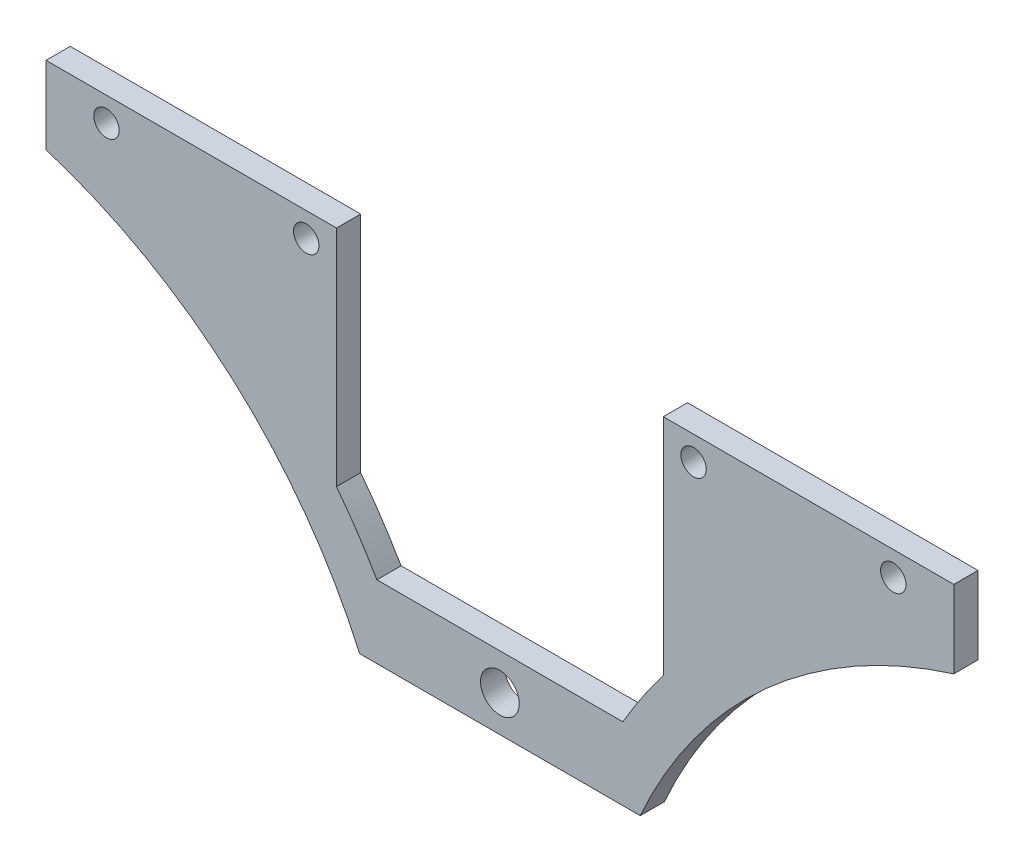
ISO-10303-21;
HEADER;
FILE_DESCRIPTION(('STEP AP214'),'2;1');
FILE_NAME('part.step','',(''),(''),'','','');
FILE_SCHEMA(('AUTOMOTIVE_DESIGN { 1 0 10303 214 1 1 1 1 }'));
ENDSEC;
DATA;
#1=APPLICATION_CONTEXT('core data for automotive mechanical design processes');
#2=APPLICATION_PROTOCOL_DEFINITION('international standard','automotive_design',2000,#1);
#3=PRODUCT_CONTEXT('',#1,'mechanical');
#4=PRODUCT('Part','Part','',(#3));
#5=PRODUCT_RELATED_PRODUCT_CATEGORY('part','',(#4));
#6=PRODUCT_DEFINITION_FORMATION('','',#4);
#7=PRODUCT_DEFINITION_CONTEXT('part definition',#1,'design');
#8=PRODUCT_DEFINITION('design','',#6,#7);
#9=PRODUCT_DEFINITION_SHAPE('','',#8);
#10=(LENGTH_UNIT() NAMED_UNIT(*) SI_UNIT(.MILLI.,.METRE.));
#11=(NAMED_UNIT(*) PLANE_ANGLE_UNIT() SI_UNIT($,.RADIAN.));
#12=(NAMED_UNIT(*) SI_UNIT($,.STERADIAN.) SOLID_ANGLE_UNIT());
#13=UNCERTAINTY_MEASURE_WITH_UNIT(LENGTH_MEASURE(1.E-05),#10,'distance_accuracy_value','');
#14=(GEOMETRIC_REPRESENTATION_CONTEXT(3) GLOBAL_UNCERTAINTY_ASSIGNED_CONTEXT((#13)) GLOBAL_UNIT_ASSIGNED_CONTEXT((#10,
#11,#12)) REPRESENTATION_CONTEXT('',''));
#15=CARTESIAN_POINT('',(0.,0.,0.));
#16=DIRECTION('',(0.,0.,1.));
#17=DIRECTION('',(1.,0.,0.));
#18=AXIS2_PLACEMENT_3D('',#15,#16,#17);
#19=CARTESIAN_POINT('',(-50.0000000000002,-19.9999999999996,2.));
#20=DIRECTION('',(0.,0.,-1.));
#21=DIRECTION('',(-1.,0.,0.));
#22=AXIS2_PLACEMENT_3D('',#19,#20,#21);
#23=CYLINDRICAL_SURFACE('',#22,46.);
#24=CARTESIAN_POINT('',(-50.0000000000002,-19.9999999999996,0.));
#25=DIRECTION('',(0.,0.,1.));
#26=DIRECTION('',(1.,0.,0.));
#27=AXIS2_PLACEMENT_3D('',#24,#25,#26);
#28=CIRCLE('',#27,46.);
#29=CARTESIAN_POINT('',(-13.4999999999999,7.99553535833889,0.));
#30=VERTEX_POINT('',#29);
#31=CARTESIAN_POINT('',(-10.1628314259158,3.00000000000007,0.));
#32=VERTEX_POINT('',#31);
#33=EDGE_CURVE('E211',#30,#32,#28,.F.);
#34=ORIENTED_EDGE('',*,*,#33,.F.);
#35=DIRECTION('',(0.,0.,-1.));
#36=VECTOR('',#35,1.);
#37=CARTESIAN_POINT('',(-13.4999999999999,7.99553535833889,2.));
#38=LINE('',#37,#36);
#39=CARTESIAN_POINT('',(-13.4999999999999,7.99553535833889,2.));
#40=VERTEX_POINT('',#39);
#41=EDGE_CURVE('E11',#40,#30,#38,.T.);
#42=ORIENTED_EDGE('',*,*,#41,.F.);
#43=CARTESIAN_POINT('',(-50.0000000000002,-19.9999999999996,2.));
#44=DIRECTION('',(0.,0.,1.));
#45=DIRECTION('',(1.,0.,0.));
#46=AXIS2_PLACEMENT_3D('',#43,#44,#45);
#47=CIRCLE('',#46,46.);
#48=CARTESIAN_POINT('',(-10.1628314259158,3.00000000000007,2.));
#49=VERTEX_POINT('',#48);
#50=EDGE_CURVE('E264',#40,#49,#47,.F.);
#51=ORIENTED_EDGE('',*,*,#50,.T.);
#52=DIRECTION('',(0.,0.,-1.));
#53=VECTOR('',#52,1.);
#54=CARTESIAN_POINT('',(-10.1628314259158,3.00000000000007,2.));
#55=LINE('',#54,#53);
#56=EDGE_CURVE('E61',#49,#32,#55,.T.);
#57=ORIENTED_EDGE('',*,*,#56,.T.);
#58=EDGE_LOOP('',(#34,#42,#51,#57));
#59=FACE_BOUND('',#58,.T.);
#60=ADVANCED_FACE('F41',(#59),#23,.T.);
#61=CARTESIAN_POINT('',(-13.5,1.05042631195923E-13,2.));
#62=DIRECTION('',(1.,0.,0.));
#63=DIRECTION('',(0.,1.,0.));
#64=AXIS2_PLACEMENT_3D('',#61,#62,#63);
#65=PLANE('',#64);
#66=DIRECTION('',(0.,-1.,0.));
#67=VECTOR('',#66,1.);
#68=CARTESIAN_POINT('',(-13.5,1.05042631195923E-13,0.));
#69=LINE('',#68,#67);
#70=CARTESIAN_POINT('',(-13.4999999999998,26.5000000000001,0.));
#71=VERTEX_POINT('',#70);
#72=EDGE_CURVE('E216',#71,#30,#69,.T.);
#73=ORIENTED_EDGE('',*,*,#72,.F.);
#74=DIRECTION('',(0.,0.,-1.));
#75=VECTOR('',#74,1.);
#76=CARTESIAN_POINT('',(-13.4999999999998,26.5000000000001,2.));
#77=LINE('',#76,#75);
#78=CARTESIAN_POINT('',(-13.4999999999998,26.5000000000001,2.));
#79=VERTEX_POINT('',#78);
#80=EDGE_CURVE('E52',#79,#71,#77,.T.);
#81=ORIENTED_EDGE('',*,*,#80,.F.);
#82=DIRECTION('',(0.,-1.,0.));
#83=VECTOR('',#82,1.);
#84=CARTESIAN_POINT('',(-13.5,1.05042631195923E-13,2.));
#85=LINE('',#84,#83);
#86=EDGE_CURVE('E267',#79,#40,#85,.T.);
#87=ORIENTED_EDGE('',*,*,#86,.T.);
#88=ORIENTED_EDGE('',*,*,#41,.T.);
#89=EDGE_LOOP('',(#73,#81,#87,#88));
#90=FACE_BOUND('',#89,.T.);
#91=ADVANCED_FACE('F272',(#90),#65,.T.);
#92=CARTESIAN_POINT('',(2.14527469862465E-13,26.5,2.));
#93=DIRECTION('',(0.,-1.,0.));
#94=DIRECTION('',(1.,0.,0.));
#95=AXIS2_PLACEMENT_3D('',#92,#93,#94);
#96=PLANE('',#95);
#97=DIRECTION('',(-1.,0.,0.));
#98=VECTOR('',#97,1.);
#99=CARTESIAN_POINT('',(2.14527469862465E-13,26.5,0.));
#100=LINE('',#99,#98);
#101=CARTESIAN_POINT('',(-37.4999999999998,26.5000000000003,0.));
#102=VERTEX_POINT('',#101);
#103=EDGE_CURVE('E223',#71,#102,#100,.T.);
#104=ORIENTED_EDGE('',*,*,#103,.T.);
#105=DIRECTION('',(0.,0.,-1.));
#106=VECTOR('',#105,1.);
#107=CARTESIAN_POINT('',(-37.4999999999998,26.5000000000003,2.));
#108=LINE('',#107,#106);
#109=CARTESIAN_POINT('',(-37.4999999999998,26.5000000000003,2.));
#110=VERTEX_POINT('',#109);
#111=EDGE_CURVE('E185',#110,#102,#108,.T.);
#112=ORIENTED_EDGE('',*,*,#111,.F.);
#113=DIRECTION('',(-1.,0.,0.));
#114=VECTOR('',#113,1.);
#115=CARTESIAN_POINT('',(2.14527469862465E-13,26.5,2.));
#116=LINE('',#115,#114);
#117=EDGE_CURVE('E275',#79,#110,#116,.T.);
#118=ORIENTED_EDGE('',*,*,#117,.F.);
#119=ORIENTED_EDGE('',*,*,#80,.T.);
#120=EDGE_LOOP('',(#104,#112,#118,#119));
#121=FACE_BOUND('',#120,.T.);
#122=ADVANCED_FACE('F312',(#121),#96,.F.);
#123=CARTESIAN_POINT('',(-37.5000000000007,1.21910988368242E-12,2.));
#124=DIRECTION('',(1.,0.,0.));
#125=DIRECTION('',(0.,1.,0.));
#126=AXIS2_PLACEMENT_3D('',#123,#124,#125);
#127=PLANE('',#126);
#128=DIRECTION('',(0.,-1.,0.));
#129=VECTOR('',#128,1.);
#130=CARTESIAN_POINT('',(-37.5000000000007,1.21910988368242E-12,0.));
#131=LINE('',#130,#129);
#132=CARTESIAN_POINT('',(-37.5,20.0967579736816,0.));
#133=VERTEX_POINT('',#132);
#134=EDGE_CURVE('E227',#102,#133,#131,.T.);
#135=ORIENTED_EDGE('',*,*,#134,.T.);
#136=DIRECTION('',(0.,0.,-1.));
#137=VECTOR('',#136,1.);
#138=CARTESIAN_POINT('',(-37.5,20.0967579736816,2.));
#139=LINE('',#138,#137);
#140=CARTESIAN_POINT('',(-37.5,20.0967579736816,2.));
#141=VERTEX_POINT('',#140);
#142=EDGE_CURVE('E181',#141,#133,#139,.T.);
#143=ORIENTED_EDGE('',*,*,#142,.F.);
#144=DIRECTION('',(0.,-1.,0.));
#145=VECTOR('',#144,1.);
#146=CARTESIAN_POINT('',(-37.5000000000007,1.21910988368242E-12,2.));
#147=LINE('',#146,#145);
#148=EDGE_CURVE('E278',#110,#141,#147,.T.);
#149=ORIENTED_EDGE('',*,*,#148,.F.);
#150=ORIENTED_EDGE('',*,*,#111,.T.);
#151=EDGE_LOOP('',(#135,#143,#149,#150));
#152=FACE_BOUND('',#151,.T.);
#153=ADVANCED_FACE('F317',(#152),#127,.F.);
#154=CARTESIAN_POINT('',(-50.0000000000002,-19.9999999999996,2.));
#155=DIRECTION('',(0.,0.,-1.));
#156=DIRECTION('',(-1.,0.,0.));
#157=AXIS2_PLACEMENT_3D('',#154,#155,#156);
#158=CYLINDRICAL_SURFACE('',#157,41.9999999999998);
#159=CARTESIAN_POINT('',(-50.0000000000002,-19.9999999999996,0.));
#160=DIRECTION('',(0.,0.,1.));
#161=DIRECTION('',(1.,0.,0.));
#162=AXIS2_PLACEMENT_3D('',#159,#160,#161);
#163=CIRCLE('',#162,41.9999999999998);
#164=CARTESIAN_POINT('',(-11.594271260657,-2.99999999999992,0.));
#165=VERTEX_POINT('',#164);
#166=EDGE_CURVE('E231',#133,#165,#163,.F.);
#167=ORIENTED_EDGE('',*,*,#166,.T.);
#168=DIRECTION('',(0.,0.,-1.));
#169=VECTOR('',#168,1.);
#170=CARTESIAN_POINT('',(-11.594271260657,-2.99999999999992,2.));
#171=LINE('',#170,#169);
#172=CARTESIAN_POINT('',(-11.594271260657,-2.99999999999992,2.));
#173=VERTEX_POINT('',#172);
#174=EDGE_CURVE('E177',#173,#165,#171,.T.);
#175=ORIENTED_EDGE('',*,*,#174,.F.);
#176=CARTESIAN_POINT('',(-50.0000000000002,-19.9999999999996,2.));
#177=DIRECTION('',(0.,0.,1.));
#178=DIRECTION('',(1.,0.,0.));
#179=AXIS2_PLACEMENT_3D('',#176,#177,#178);
#180=CIRCLE('',#179,41.9999999999998);
#181=EDGE_CURVE('E285',#141,#173,#180,.F.);
#182=ORIENTED_EDGE('',*,*,#181,.F.);
#183=ORIENTED_EDGE('',*,*,#142,.T.);
#184=EDGE_LOOP('',(#167,#175,#182,#183));
#185=FACE_BOUND('',#184,.T.);
#186=ADVANCED_FACE('F321',(#185),#158,.F.);
#187=CARTESIAN_POINT('',(0.,-2.99999999999992,2.));
#188=DIRECTION('',(0.,1.,0.));
#189=DIRECTION('',(0.,0.,1.));
#190=AXIS2_PLACEMENT_3D('',#187,#188,#189);
#191=PLANE('',#190);
#192=DIRECTION('',(1.,0.,0.));
#193=VECTOR('',#192,1.);
#194=CARTESIAN_POINT('',(0.,-2.99999999999992,0.));
#195=LINE('',#194,#193);
#196=CARTESIAN_POINT('',(11.594271260657,-2.99999999999992,0.));
#197=VERTEX_POINT('',#196);
#198=EDGE_CURVE('E235',#165,#197,#195,.T.);
#199=ORIENTED_EDGE('',*,*,#198,.T.);
#200=DIRECTION('',(0.,0.,-1.));
#201=VECTOR('',#200,1.);
#202=CARTESIAN_POINT('',(11.594271260657,-2.99999999999992,2.));
#203=LINE('',#202,#201);
#204=CARTESIAN_POINT('',(11.594271260657,-2.99999999999992,2.));
#205=VERTEX_POINT('',#204);
#206=EDGE_CURVE('E174',#205,#197,#203,.T.);
#207=ORIENTED_EDGE('',*,*,#206,.F.);
#208=DIRECTION('',(1.,0.,0.));
#209=VECTOR('',#208,1.);
#210=CARTESIAN_POINT('',(0.,-2.99999999999992,2.));
#211=LINE('',#210,#209);
#212=EDGE_CURVE('E289',#173,#205,#211,.T.);
#213=ORIENTED_EDGE('',*,*,#212,.F.);
#214=ORIENTED_EDGE('',*,*,#174,.T.);
#215=EDGE_LOOP('',(#199,#207,#213,#214));
#216=FACE_BOUND('',#215,.T.);
#217=ADVANCED_FACE('F325',(#216),#191,.F.);
#218=CARTESIAN_POINT('',(50.0000000000001,-20.,2.));
#219=DIRECTION('',(0.,0.,-1.));
#220=DIRECTION('',(-1.,0.,0.));
#221=AXIS2_PLACEMENT_3D('',#218,#219,#220);
#222=CYLINDRICAL_SURFACE('',#221,42.);
#223=CARTESIAN_POINT('',(50.0000000000001,-20.,0.));
#224=DIRECTION('',(0.,0.,1.));
#225=DIRECTION('',(1.,0.,0.));
#226=AXIS2_PLACEMENT_3D('',#223,#224,#225);
#227=CIRCLE('',#226,42.);
#228=CARTESIAN_POINT('',(37.5,20.0967579736816,0.));
#229=VERTEX_POINT('',#228);
#230=EDGE_CURVE('E239',#229,#197,#227,.T.);
#231=ORIENTED_EDGE('',*,*,#230,.F.);
#232=DIRECTION('',(0.,0.,-1.));
#233=VECTOR('',#232,1.);
#234=CARTESIAN_POINT('',(37.5,20.0967579736816,2.));
#235=LINE('',#234,#233);
#236=CARTESIAN_POINT('',(37.5,20.0967579736816,2.));
#237=VERTEX_POINT('',#236);
#238=EDGE_CURVE('E171',#237,#229,#235,.T.);
#239=ORIENTED_EDGE('',*,*,#238,.F.);
#240=CARTESIAN_POINT('',(50.0000000000001,-20.,2.));
#241=DIRECTION('',(0.,0.,1.));
#242=DIRECTION('',(1.,0.,0.));
#243=AXIS2_PLACEMENT_3D('',#240,#241,#242);
#244=CIRCLE('',#243,42.);
#245=EDGE_CURVE('E292',#237,#205,#244,.T.);
#246=ORIENTED_EDGE('',*,*,#245,.T.);
#247=ORIENTED_EDGE('',*,*,#206,.T.);
#248=EDGE_LOOP('',(#231,#239,#246,#247));
#249=FACE_BOUND('',#248,.T.);
#250=ADVANCED_FACE('F329',(#249),#222,.F.);
#251=CARTESIAN_POINT('',(37.5,0.,2.));
#252=DIRECTION('',(1.,0.,0.));
#253=DIRECTION('',(0.,0.,-1.));
#254=AXIS2_PLACEMENT_3D('',#251,#252,#253);
#255=PLANE('',#254);
#256=DIRECTION('',(0.,-1.,0.));
#257=VECTOR('',#256,1.);
#258=CARTESIAN_POINT('',(37.5,0.,0.));
#259=LINE('',#258,#257);
#260=CARTESIAN_POINT('',(37.5,26.5,0.));
#261=VERTEX_POINT('',#260);
#262=EDGE_CURVE('E243',#261,#229,#259,.T.);
#263=ORIENTED_EDGE('',*,*,#262,.F.);
#264=DIRECTION('',(0.,0.,-1.));
#265=VECTOR('',#264,1.);
#266=CARTESIAN_POINT('',(37.5,26.5,2.));
#267=LINE('',#266,#265);
#268=CARTESIAN_POINT('',(37.5,26.5,2.));
#269=VERTEX_POINT('',#268);
#270=EDGE_CURVE('E164',#269,#261,#267,.T.);
#271=ORIENTED_EDGE('',*,*,#270,.F.);
#272=DIRECTION('',(0.,-1.,0.));
#273=VECTOR('',#272,1.);
#274=CARTESIAN_POINT('',(37.5,0.,2.));
#275=LINE('',#274,#273);
#276=EDGE_CURVE('E296',#269,#237,#275,.T.);
#277=ORIENTED_EDGE('',*,*,#276,.T.);
#278=ORIENTED_EDGE('',*,*,#238,.T.);
#279=EDGE_LOOP('',(#263,#271,#277,#278));
#280=FACE_BOUND('',#279,.T.);
#281=ADVANCED_FACE('F333',(#280),#255,.T.);
#282=CARTESIAN_POINT('',(0.,26.5,2.));
#283=DIRECTION('',(0.,1.,0.));
#284=DIRECTION('',(0.,0.,1.));
#285=AXIS2_PLACEMENT_3D('',#282,#283,#284);
#286=PLANE('',#285);
#287=DIRECTION('',(1.,0.,0.));
#288=VECTOR('',#287,1.);
#289=CARTESIAN_POINT('',(0.,26.5,0.));
#290=LINE('',#289,#288);
#291=CARTESIAN_POINT('',(13.5,26.5,0.));
#292=VERTEX_POINT('',#291);
#293=EDGE_CURVE('E247',#292,#261,#290,.T.);
#294=ORIENTED_EDGE('',*,*,#293,.F.);
#295=DIRECTION('',(0.,0.,-1.));
#296=VECTOR('',#295,1.);
#297=CARTESIAN_POINT('',(13.5,26.5,2.));
#298=LINE('',#297,#296);
#299=CARTESIAN_POINT('',(13.5,26.5,2.));
#300=VERTEX_POINT('',#299);
#301=EDGE_CURVE('E160',#300,#292,#298,.T.);
#302=ORIENTED_EDGE('',*,*,#301,.F.);
#303=DIRECTION('',(1.,0.,0.));
#304=VECTOR('',#303,1.);
#305=CARTESIAN_POINT('',(0.,26.5,2.));
#306=LINE('',#305,#304);
#307=EDGE_CURVE('E152',#300,#269,#306,.T.);
#308=ORIENTED_EDGE('',*,*,#307,.T.);
#309=ORIENTED_EDGE('',*,*,#270,.T.);
#310=EDGE_LOOP('',(#294,#302,#308,#309));
#311=FACE_BOUND('',#310,.T.);
#312=ADVANCED_FACE('F303',(#311),#286,.T.);
#313=CARTESIAN_POINT('',(13.5,0.,2.));
#314=DIRECTION('',(1.,0.,0.));
#315=DIRECTION('',(0.,1.,0.));
#316=AXIS2_PLACEMENT_3D('',#313,#314,#315);
#317=PLANE('',#316);
#318=DIRECTION('',(0.,-1.,0.));
#319=VECTOR('',#318,1.);
#320=CARTESIAN_POINT('',(13.5,0.,0.));
#321=LINE('',#320,#319);
#322=CARTESIAN_POINT('',(13.5,7.99553535833879,0.));
#323=VERTEX_POINT('',#322);
#324=EDGE_CURVE('E158',#292,#323,#321,.T.);
#325=ORIENTED_EDGE('',*,*,#324,.T.);
#326=DIRECTION('',(0.,0.,-1.));
#327=VECTOR('',#326,1.);
#328=CARTESIAN_POINT('',(13.5,7.99553535833879,2.));
#329=LINE('',#328,#327);
#330=CARTESIAN_POINT('',(13.5,7.99553535833879,2.));
#331=VERTEX_POINT('',#330);
#332=EDGE_CURVE('E139',#331,#323,#329,.T.);
#333=ORIENTED_EDGE('',*,*,#332,.F.);
#334=DIRECTION('',(0.,-1.,0.));
#335=VECTOR('',#334,1.);
#336=CARTESIAN_POINT('',(13.5,0.,2.));
#337=LINE('',#336,#335);
#338=EDGE_CURVE('E145',#300,#331,#337,.T.);
#339=ORIENTED_EDGE('',*,*,#338,.F.);
#340=ORIENTED_EDGE('',*,*,#301,.T.);
#341=EDGE_LOOP('',(#325,#333,#339,#340));
#342=FACE_BOUND('',#341,.T.);
#343=ADVANCED_FACE('F156',(#342),#317,.F.);
#344=CARTESIAN_POINT('',(50.0000000000001,-20.,2.));
#345=DIRECTION('',(0.,0.,-1.));
#346=DIRECTION('',(-1.,0.,0.));
#347=AXIS2_PLACEMENT_3D('',#344,#345,#346);
#348=CYLINDRICAL_SURFACE('',#347,46.);
#349=CARTESIAN_POINT('',(50.0000000000001,-20.,0.));
#350=DIRECTION('',(0.,0.,1.));
#351=DIRECTION('',(1.,0.,0.));
#352=AXIS2_PLACEMENT_3D('',#349,#350,#351);
#353=CIRCLE('',#352,46.);
#354=CARTESIAN_POINT('',(10.1628314259159,2.99999999999999,0.));
#355=VERTEX_POINT('',#354);
#356=EDGE_CURVE('E253',#323,#355,#353,.T.);
#357=ORIENTED_EDGE('',*,*,#356,.T.);
#358=DIRECTION('',(0.,0.,-1.));
#359=VECTOR('',#358,1.);
#360=CARTESIAN_POINT('',(10.1628314259159,2.99999999999999,2.));
#361=LINE('',#360,#359);
#362=CARTESIAN_POINT('',(10.1628314259159,2.99999999999999,2.));
#363=VERTEX_POINT('',#362);
#364=EDGE_CURVE('E99',#363,#355,#361,.T.);
#365=ORIENTED_EDGE('',*,*,#364,.F.);
#366=CARTESIAN_POINT('',(50.0000000000001,-20.,2.));
#367=DIRECTION('',(0.,0.,1.));
#368=DIRECTION('',(1.,0.,0.));
#369=AXIS2_PLACEMENT_3D('',#366,#367,#368);
#370=CIRCLE('',#369,46.);
#371=EDGE_CURVE('E135',#331,#363,#370,.T.);
#372=ORIENTED_EDGE('',*,*,#371,.F.);
#373=ORIENTED_EDGE('',*,*,#332,.T.);
#374=EDGE_LOOP('',(#357,#365,#372,#373));
#375=FACE_BOUND('',#374,.T.);
#376=ADVANCED_FACE('F137',(#375),#348,.T.);
#377=CARTESIAN_POINT('',(0.,0.,2.));
#378=DIRECTION('',(0.,0.,-1.));
#379=DIRECTION('',(-1.,0.,0.));
#380=AXIS2_PLACEMENT_3D('',#377,#378,#379);
#381=CYLINDRICAL_SURFACE('',#380,1.6);
#382=CARTESIAN_POINT('',(0.,0.,2.));
#383=DIRECTION('',(0.,0.,1.));
#384=DIRECTION('',(1.,0.,0.));
#385=AXIS2_PLACEMENT_3D('',#382,#383,#384);
#386=CIRCLE('',#385,1.6);
#387=CARTESIAN_POINT('',(1.59999999999999,0.,2.));
#388=VERTEX_POINT('',#387);
#389=EDGE_CURVE('E259',#388,#388,#386,.T.);
#390=ORIENTED_EDGE('',*,*,#389,.T.);
#391=EDGE_LOOP('',(#390));
#392=FACE_BOUND('',#391,.T.);
#393=CARTESIAN_POINT('',(0.,0.,0.));
#394=DIRECTION('',(0.,0.,1.));
#395=DIRECTION('',(1.,0.,0.));
#396=AXIS2_PLACEMENT_3D('',#393,#394,#395);
#397=CIRCLE('',#396,1.6);
#398=CARTESIAN_POINT('',(1.59999999999999,0.,0.));
#399=VERTEX_POINT('',#398);
#400=EDGE_CURVE('E206',#399,#399,#397,.T.);
#401=ORIENTED_EDGE('',*,*,#400,.F.);
#402=EDGE_LOOP('',(#401));
#403=FACE_BOUND('',#402,.T.);
#404=ADVANCED_FACE('F43',(#392,#403),#381,.F.);
#405=CARTESIAN_POINT('',(0.,3.00000000000003,2.));
#406=DIRECTION('',(0.,1.,0.));
#407=DIRECTION('',(-1.,0.,0.));
#408=AXIS2_PLACEMENT_3D('',#405,#406,#407);
#409=PLANE('',#408);
#410=DIRECTION('',(1.,0.,0.));
#411=VECTOR('',#410,1.);
#412=CARTESIAN_POINT('',(0.,3.00000000000003,0.));
#413=LINE('',#412,#411);
#414=EDGE_CURVE('E256',#32,#355,#413,.T.);
#415=ORIENTED_EDGE('',*,*,#414,.F.);
#416=ORIENTED_EDGE('',*,*,#56,.F.);
#417=DIRECTION('',(1.,0.,0.));
#418=VECTOR('',#417,1.);
#419=CARTESIAN_POINT('',(0.,3.00000000000003,2.));
#420=LINE('',#419,#418);
#421=EDGE_CURVE('E144',#49,#363,#420,.T.);
#422=ORIENTED_EDGE('',*,*,#421,.T.);
#423=ORIENTED_EDGE('',*,*,#364,.T.);
#424=EDGE_LOOP('',(#415,#416,#422,#423));
#425=FACE_BOUND('',#424,.T.);
#426=ADVANCED_FACE('F262',(#425),#409,.T.);
#427=CARTESIAN_POINT('',(0.,0.,2.));
#428=DIRECTION('',(0.,0.,1.));
#429=DIRECTION('',(1.,0.,0.));
#430=AXIS2_PLACEMENT_3D('',#427,#428,#429);
#431=PLANE('',#430);
#432=CARTESIAN_POINT('',(32.4999999999998,24.5000000000001,2.));
#433=DIRECTION('',(0.,0.,1.));
#434=DIRECTION('',(-1.,0.,0.));
#435=AXIS2_PLACEMENT_3D('',#432,#433,#434);
#436=CIRCLE('',#435,1.05);
#437=CARTESIAN_POINT('',(31.4499999999998,24.5000000000001,2.));
#438=VERTEX_POINT('',#437);
#439=EDGE_CURVE('E386',#438,#438,#436,.T.);
#440=ORIENTED_EDGE('',*,*,#439,.F.);
#441=EDGE_LOOP('',(#440));
#442=FACE_BOUND('',#441,.T.);
#443=CARTESIAN_POINT('',(-15.9999999999998,24.5000000000001,2.));
#444=DIRECTION('',(0.,0.,1.));
#445=DIRECTION('',(1.,0.,0.));
#446=AXIS2_PLACEMENT_3D('',#443,#444,#445);
#447=CIRCLE('',#446,1.05);
#448=CARTESIAN_POINT('',(-14.9499999999998,24.5000000000001,2.));
#449=VERTEX_POINT('',#448);
#450=EDGE_CURVE('E379',#449,#449,#447,.T.);
#451=ORIENTED_EDGE('',*,*,#450,.F.);
#452=EDGE_LOOP('',(#451));
#453=FACE_BOUND('',#452,.T.);
#454=CARTESIAN_POINT('',(-32.4999999999998,24.5000000000001,2.));
#455=DIRECTION('',(0.,0.,1.));
#456=DIRECTION('',(1.,0.,0.));
#457=AXIS2_PLACEMENT_3D('',#454,#455,#456);
#458=CIRCLE('',#457,1.05);
#459=CARTESIAN_POINT('',(-31.4499999999998,24.5000000000001,2.));
#460=VERTEX_POINT('',#459);
#461=EDGE_CURVE('E371',#460,#460,#458,.T.);
#462=ORIENTED_EDGE('',*,*,#461,.F.);
#463=EDGE_LOOP('',(#462));
#464=FACE_BOUND('',#463,.T.);
#465=CARTESIAN_POINT('',(15.9999999999998,24.5000000000001,2.));
#466=DIRECTION('',(0.,0.,1.));
#467=DIRECTION('',(-1.,0.,0.));
#468=AXIS2_PLACEMENT_3D('',#465,#466,#467);
#469=CIRCLE('',#468,1.05);
#470=CARTESIAN_POINT('',(14.9499999999998,24.5000000000001,2.));
#471=VERTEX_POINT('',#470);
#472=EDGE_CURVE('E196',#471,#471,#469,.T.);
#473=ORIENTED_EDGE('',*,*,#472,.F.);
#474=EDGE_LOOP('',(#473));
#475=FACE_BOUND('',#474,.T.);
#476=ORIENTED_EDGE('',*,*,#389,.F.);
#477=EDGE_LOOP('',(#476));
#478=FACE_BOUND('',#477,.T.);
#479=ORIENTED_EDGE('',*,*,#50,.F.);
#480=ORIENTED_EDGE('',*,*,#86,.F.);
#481=ORIENTED_EDGE('',*,*,#117,.T.);
#482=ORIENTED_EDGE('',*,*,#148,.T.);
#483=ORIENTED_EDGE('',*,*,#181,.T.);
#484=ORIENTED_EDGE('',*,*,#212,.T.);
#485=ORIENTED_EDGE('',*,*,#245,.F.);
#486=ORIENTED_EDGE('',*,*,#276,.F.);
#487=ORIENTED_EDGE('',*,*,#307,.F.);
#488=ORIENTED_EDGE('',*,*,#338,.T.);
#489=ORIENTED_EDGE('',*,*,#371,.T.);
#490=ORIENTED_EDGE('',*,*,#421,.F.);
#491=EDGE_LOOP('',(#479,#480,#481,#482,#483,#484,#485,#486,#487,#488,#489,#490));
#492=FACE_BOUND('',#491,.T.);
#493=ADVANCED_FACE('F149',(#442,#453,#464,#475,#478,#492),#431,.T.);
#494=CARTESIAN_POINT('',(0.,0.,0.));
#495=DIRECTION('',(0.,0.,1.));
#496=DIRECTION('',(1.,0.,0.));
#497=AXIS2_PLACEMENT_3D('',#494,#495,#496);
#498=PLANE('',#497);
#499=CARTESIAN_POINT('',(32.4999999999998,24.5000000000001,0.));
#500=DIRECTION('',(0.,0.,1.));
#501=DIRECTION('',(1.,0.,0.));
#502=AXIS2_PLACEMENT_3D('',#499,#500,#501);
#503=CIRCLE('',#502,1.05);
#504=CARTESIAN_POINT('',(33.5499999999998,24.5000000000001,0.));
#505=VERTEX_POINT('',#504);
#506=EDGE_CURVE('E45',#505,#505,#503,.T.);
#507=ORIENTED_EDGE('',*,*,#506,.T.);
#508=EDGE_LOOP('',(#507));
#509=FACE_BOUND('',#508,.T.);
#510=CARTESIAN_POINT('',(-15.9999999999998,24.5000000000001,0.));
#511=DIRECTION('',(0.,0.,1.));
#512=DIRECTION('',(1.,0.,0.));
#513=AXIS2_PLACEMENT_3D('',#510,#511,#512);
#514=CIRCLE('',#513,1.05);
#515=CARTESIAN_POINT('',(-14.9499999999998,24.5000000000001,0.));
#516=VERTEX_POINT('',#515);
#517=EDGE_CURVE('E199',#516,#516,#514,.T.);
#518=ORIENTED_EDGE('',*,*,#517,.T.);
#519=EDGE_LOOP('',(#518));
#520=FACE_BOUND('',#519,.T.);
#521=CARTESIAN_POINT('',(-32.4999999999998,24.5000000000001,0.));
#522=DIRECTION('',(0.,0.,1.));
#523=DIRECTION('',(1.,0.,0.));
#524=AXIS2_PLACEMENT_3D('',#521,#522,#523);
#525=CIRCLE('',#524,1.05);
#526=CARTESIAN_POINT('',(-31.4499999999998,24.5000000000001,0.));
#527=VERTEX_POINT('',#526);
#528=EDGE_CURVE('E195',#527,#527,#525,.T.);
#529=ORIENTED_EDGE('',*,*,#528,.T.);
#530=EDGE_LOOP('',(#529));
#531=FACE_BOUND('',#530,.T.);
#532=CARTESIAN_POINT('',(15.9999999999998,24.5000000000001,0.));
#533=DIRECTION('',(0.,0.,1.));
#534=DIRECTION('',(1.,0.,0.));
#535=AXIS2_PLACEMENT_3D('',#532,#533,#534);
#536=CIRCLE('',#535,1.05);
#537=CARTESIAN_POINT('',(17.0499999999998,24.5000000000001,0.));
#538=VERTEX_POINT('',#537);
#539=EDGE_CURVE('E191',#538,#538,#536,.T.);
#540=ORIENTED_EDGE('',*,*,#539,.T.);
#541=EDGE_LOOP('',(#540));
#542=FACE_BOUND('',#541,.T.);
#543=ORIENTED_EDGE('',*,*,#400,.T.);
#544=EDGE_LOOP('',(#543));
#545=FACE_BOUND('',#544,.T.);
#546=ORIENTED_EDGE('',*,*,#33,.T.);
#547=ORIENTED_EDGE('',*,*,#414,.T.);
#548=ORIENTED_EDGE('',*,*,#356,.F.);
#549=ORIENTED_EDGE('',*,*,#324,.F.);
#550=ORIENTED_EDGE('',*,*,#293,.T.);
#551=ORIENTED_EDGE('',*,*,#262,.T.);
#552=ORIENTED_EDGE('',*,*,#230,.T.);
#553=ORIENTED_EDGE('',*,*,#198,.F.);
#554=ORIENTED_EDGE('',*,*,#166,.F.);
#555=ORIENTED_EDGE('',*,*,#134,.F.);
#556=ORIENTED_EDGE('',*,*,#103,.F.);
#557=ORIENTED_EDGE('',*,*,#72,.T.);
#558=EDGE_LOOP('',(#546,#547,#548,#549,#550,#551,#552,#553,#554,#555,#556,#557));
#559=FACE_BOUND('',#558,.T.);
#560=ADVANCED_FACE('F306',(#509,#520,#531,#542,#545,#559),#498,.F.);
#561=CARTESIAN_POINT('',(15.9999999999998,24.5000000000001,-8.));
#562=DIRECTION('',(0.,0.,1.));
#563=DIRECTION('',(1.,0.,0.));
#564=AXIS2_PLACEMENT_3D('',#561,#562,#563);
#565=CYLINDRICAL_SURFACE('',#564,1.05);
#566=ORIENTED_EDGE('',*,*,#472,.T.);
#567=EDGE_LOOP('',(#566));
#568=FACE_BOUND('',#567,.T.);
#569=ORIENTED_EDGE('',*,*,#539,.F.);
#570=EDGE_LOOP('',(#569));
#571=FACE_BOUND('',#570,.T.);
#572=ADVANCED_FACE('F348',(#568,#571),#565,.F.);
#573=CARTESIAN_POINT('',(-32.4999999999998,24.5000000000001,-8.));
#574=DIRECTION('',(0.,0.,1.));
#575=DIRECTION('',(1.,0.,0.));
#576=AXIS2_PLACEMENT_3D('',#573,#574,#575);
#577=CYLINDRICAL_SURFACE('',#576,1.05);
#578=ORIENTED_EDGE('',*,*,#461,.T.);
#579=EDGE_LOOP('',(#578));
#580=FACE_BOUND('',#579,.T.);
#581=ORIENTED_EDGE('',*,*,#528,.F.);
#582=EDGE_LOOP('',(#581));
#583=FACE_BOUND('',#582,.T.);
#584=ADVANCED_FACE('F354',(#580,#583),#577,.F.);
#585=CARTESIAN_POINT('',(-15.9999999999998,24.5000000000001,-8.));
#586=DIRECTION('',(0.,0.,1.));
#587=DIRECTION('',(1.,0.,0.));
#588=AXIS2_PLACEMENT_3D('',#585,#586,#587);
#589=CYLINDRICAL_SURFACE('',#588,1.05);
#590=ORIENTED_EDGE('',*,*,#450,.T.);
#591=EDGE_LOOP('',(#590));
#592=FACE_BOUND('',#591,.T.);
#593=ORIENTED_EDGE('',*,*,#517,.F.);
#594=EDGE_LOOP('',(#593));
#595=FACE_BOUND('',#594,.T.);
#596=ADVANCED_FACE('F359',(#592,#595),#589,.F.);
#597=CARTESIAN_POINT('',(32.4999999999998,24.5000000000001,-8.));
#598=DIRECTION('',(0.,0.,1.));
#599=DIRECTION('',(1.,0.,0.));
#600=AXIS2_PLACEMENT_3D('',#597,#598,#599);
#601=CYLINDRICAL_SURFACE('',#600,1.05);
#602=ORIENTED_EDGE('',*,*,#439,.T.);
#603=EDGE_LOOP('',(#602));
#604=FACE_BOUND('',#603,.T.);
#605=ORIENTED_EDGE('',*,*,#506,.F.);
#606=EDGE_LOOP('',(#605));
#607=FACE_BOUND('',#606,.T.);
#608=ADVANCED_FACE('F356',(#604,#607),#601,.F.);
#609=CLOSED_SHELL('',(#60,#91,#122,#153,#186,#217,#250,#281,#312,#343,#376,#404,#426,#493,#560,
#572,#584,#596,#608));
#610=MANIFOLD_SOLID_BREP('B2',#609);
#611=ADVANCED_BREP_SHAPE_REPRESENTATION('',(#18,#610),#14);
#612=SHAPE_DEFINITION_REPRESENTATION(#9,#611);
ENDSEC;
END-ISO-10303-21;
